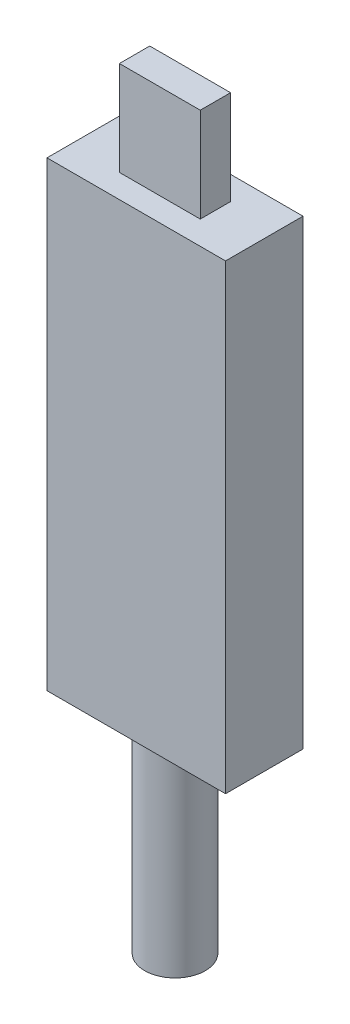
ISO-10303-21;
HEADER;
FILE_DESCRIPTION(('STEP AP214'),'2;1');
FILE_NAME('part.step','',(''),(''),'','','');
FILE_SCHEMA(('AUTOMOTIVE_DESIGN { 1 0 10303 214 1 1 1 1 }'));
ENDSEC;
DATA;
#1=APPLICATION_CONTEXT('core data for automotive mechanical design processes');
#2=APPLICATION_PROTOCOL_DEFINITION('international standard','automotive_design',2000,#1);
#3=PRODUCT_CONTEXT('',#1,'mechanical');
#4=PRODUCT('Part','Part','',(#3));
#5=PRODUCT_RELATED_PRODUCT_CATEGORY('part','',(#4));
#6=PRODUCT_DEFINITION_FORMATION('','',#4);
#7=PRODUCT_DEFINITION_CONTEXT('part definition',#1,'design');
#8=PRODUCT_DEFINITION('design','',#6,#7);
#9=PRODUCT_DEFINITION_SHAPE('','',#8);
#10=(LENGTH_UNIT() NAMED_UNIT(*) SI_UNIT(.MILLI.,.METRE.));
#11=(NAMED_UNIT(*) PLANE_ANGLE_UNIT() SI_UNIT($,.RADIAN.));
#12=(NAMED_UNIT(*) SI_UNIT($,.STERADIAN.) SOLID_ANGLE_UNIT());
#13=UNCERTAINTY_MEASURE_WITH_UNIT(LENGTH_MEASURE(1.E-05),#10,'distance_accuracy_value','');
#14=(GEOMETRIC_REPRESENTATION_CONTEXT(3) GLOBAL_UNCERTAINTY_ASSIGNED_CONTEXT((#13)) GLOBAL_UNIT_ASSIGNED_CONTEXT((#10,
#11,#12)) REPRESENTATION_CONTEXT('',''));
#15=CARTESIAN_POINT('',(0.,0.,0.));
#16=DIRECTION('',(0.,0.,1.));
#17=DIRECTION('',(1.,0.,0.));
#18=AXIS2_PLACEMENT_3D('',#15,#16,#17);
#19=CARTESIAN_POINT('',(-12.4102564102564,68.5,-3.75641025641024));
#20=DIRECTION('',(1.,0.,0.));
#21=DIRECTION('',(0.,0.,-1.));
#22=AXIS2_PLACEMENT_3D('',#19,#20,#21);
#23=PLANE('',#22);
#24=DIRECTION('',(0.,0.,1.));
#25=VECTOR('',#24,1.);
#26=CARTESIAN_POINT('',(-12.4102564102564,0.,-3.75641025641024));
#27=LINE('',#26,#25);
#28=CARTESIAN_POINT('',(-12.4102564102564,0.,-3.75641025641024));
#29=VERTEX_POINT('',#28);
#30=CARTESIAN_POINT('',(-12.4102564102564,0.,7.74358974358976));
#31=VERTEX_POINT('',#30);
#32=EDGE_CURVE('E126',#29,#31,#27,.T.);
#33=ORIENTED_EDGE('',*,*,#32,.T.);
#34=DIRECTION('',(0.,-1.,0.));
#35=VECTOR('',#34,1.);
#36=CARTESIAN_POINT('',(-12.4102564102564,68.5,7.74358974358976));
#37=LINE('',#36,#35);
#38=CARTESIAN_POINT('',(-12.4102564102564,68.5,7.74358974358976));
#39=VERTEX_POINT('',#38);
#40=EDGE_CURVE('E44',#39,#31,#37,.T.);
#41=ORIENTED_EDGE('',*,*,#40,.F.);
#42=DIRECTION('',(0.,0.,1.));
#43=VECTOR('',#42,1.);
#44=CARTESIAN_POINT('',(-12.4102564102564,68.5,-3.75641025641024));
#45=LINE('',#44,#43);
#46=CARTESIAN_POINT('',(-12.4102564102564,68.5,-3.75641025641024));
#47=VERTEX_POINT('',#46);
#48=EDGE_CURVE('E135',#47,#39,#45,.T.);
#49=ORIENTED_EDGE('',*,*,#48,.F.);
#50=DIRECTION('',(0.,-1.,0.));
#51=VECTOR('',#50,1.);
#52=CARTESIAN_POINT('',(-12.4102564102564,68.5,-3.75641025641024));
#53=LINE('',#52,#51);
#54=EDGE_CURVE('E144',#47,#29,#53,.T.);
#55=ORIENTED_EDGE('',*,*,#54,.T.);
#56=EDGE_LOOP('',(#33,#41,#49,#55));
#57=FACE_BOUND('',#56,.T.);
#58=ADVANCED_FACE('F41',(#57),#23,.F.);
#59=CARTESIAN_POINT('',(-12.4102564102564,68.5,7.74358974358976));
#60=DIRECTION('',(0.,0.,-1.));
#61=DIRECTION('',(-1.,0.,0.));
#62=AXIS2_PLACEMENT_3D('',#59,#60,#61);
#63=PLANE('',#62);
#64=DIRECTION('',(1.,0.,0.));
#65=VECTOR('',#64,1.);
#66=CARTESIAN_POINT('',(-12.4102564102564,0.,7.74358974358976));
#67=LINE('',#66,#65);
#68=CARTESIAN_POINT('',(14.0897435897436,0.,7.74358974358976));
#69=VERTEX_POINT('',#68);
#70=EDGE_CURVE('E129',#31,#69,#67,.T.);
#71=ORIENTED_EDGE('',*,*,#70,.T.);
#72=DIRECTION('',(0.,-1.,0.));
#73=VECTOR('',#72,1.);
#74=CARTESIAN_POINT('',(14.0897435897436,68.5,7.74358974358976));
#75=LINE('',#74,#73);
#76=CARTESIAN_POINT('',(14.0897435897436,68.5,7.74358974358976));
#77=VERTEX_POINT('',#76);
#78=EDGE_CURVE('E154',#77,#69,#75,.T.);
#79=ORIENTED_EDGE('',*,*,#78,.F.);
#80=DIRECTION('',(1.,0.,0.));
#81=VECTOR('',#80,1.);
#82=CARTESIAN_POINT('',(-12.4102564102564,68.5,7.74358974358976));
#83=LINE('',#82,#81);
#84=EDGE_CURVE('E138',#39,#77,#83,.T.);
#85=ORIENTED_EDGE('',*,*,#84,.F.);
#86=ORIENTED_EDGE('',*,*,#40,.T.);
#87=EDGE_LOOP('',(#71,#79,#85,#86));
#88=FACE_BOUND('',#87,.T.);
#89=ADVANCED_FACE('F163',(#88),#63,.F.);
#90=CARTESIAN_POINT('',(14.0897435897436,68.5,-3.75641025641024));
#91=DIRECTION('',(-1.,0.,0.));
#92=DIRECTION('',(0.,0.,1.));
#93=AXIS2_PLACEMENT_3D('',#90,#91,#92);
#94=PLANE('',#93);
#95=DIRECTION('',(0.,0.,-1.));
#96=VECTOR('',#95,1.);
#97=CARTESIAN_POINT('',(14.0897435897436,0.,-3.75641025641024));
#98=LINE('',#97,#96);
#99=CARTESIAN_POINT('',(14.0897435897436,0.,-3.75641025641024));
#100=VERTEX_POINT('',#99);
#101=EDGE_CURVE('E147',#69,#100,#98,.T.);
#102=ORIENTED_EDGE('',*,*,#101,.T.);
#103=DIRECTION('',(0.,-1.,0.));
#104=VECTOR('',#103,1.);
#105=CARTESIAN_POINT('',(14.0897435897436,68.5,-3.75641025641024));
#106=LINE('',#105,#104);
#107=CARTESIAN_POINT('',(14.0897435897436,68.5,-3.75641025641024));
#108=VERTEX_POINT('',#107);
#109=EDGE_CURVE('E152',#108,#100,#106,.T.);
#110=ORIENTED_EDGE('',*,*,#109,.F.);
#111=DIRECTION('',(0.,0.,-1.));
#112=VECTOR('',#111,1.);
#113=CARTESIAN_POINT('',(14.0897435897436,68.5,-3.75641025641024));
#114=LINE('',#113,#112);
#115=EDGE_CURVE('E141',#77,#108,#114,.T.);
#116=ORIENTED_EDGE('',*,*,#115,.F.);
#117=ORIENTED_EDGE('',*,*,#78,.T.);
#118=EDGE_LOOP('',(#102,#110,#116,#117));
#119=FACE_BOUND('',#118,.T.);
#120=ADVANCED_FACE('F172',(#119),#94,.F.);
#121=CARTESIAN_POINT('',(-12.4102564102564,68.5,-3.75641025641024));
#122=DIRECTION('',(0.,0.,1.));
#123=DIRECTION('',(1.,0.,0.));
#124=AXIS2_PLACEMENT_3D('',#121,#122,#123);
#125=PLANE('',#124);
#126=DIRECTION('',(-1.,0.,0.));
#127=VECTOR('',#126,1.);
#128=CARTESIAN_POINT('',(-12.4102564102564,0.,-3.75641025641024));
#129=LINE('',#128,#127);
#130=EDGE_CURVE('E139',#100,#29,#129,.T.);
#131=ORIENTED_EDGE('',*,*,#130,.T.);
#132=ORIENTED_EDGE('',*,*,#54,.F.);
#133=DIRECTION('',(-1.,0.,0.));
#134=VECTOR('',#133,1.);
#135=CARTESIAN_POINT('',(-12.4102564102564,68.5,-3.75641025641024));
#136=LINE('',#135,#134);
#137=EDGE_CURVE('E143',#108,#47,#136,.T.);
#138=ORIENTED_EDGE('',*,*,#137,.F.);
#139=ORIENTED_EDGE('',*,*,#109,.T.);
#140=EDGE_LOOP('',(#131,#132,#138,#139));
#141=FACE_BOUND('',#140,.T.);
#142=ADVANCED_FACE('F175',(#141),#125,.F.);
#143=CARTESIAN_POINT('',(0.,68.5,0.));
#144=DIRECTION('',(0.,1.,0.));
#145=DIRECTION('',(0.,0.,1.));
#146=AXIS2_PLACEMENT_3D('',#143,#144,#145);
#147=PLANE('',#146);
#148=DIRECTION('',(0.,0.,1.));
#149=VECTOR('',#148,1.);
#150=CARTESIAN_POINT('',(-5.16025641025641,68.5,-0.256410256410238));
#151=LINE('',#150,#149);
#152=CARTESIAN_POINT('',(-5.16025641025641,68.5,-0.256410256410238));
#153=VERTEX_POINT('',#152);
#154=CARTESIAN_POINT('',(-5.16025641025641,68.5,4.24358974358976));
#155=VERTEX_POINT('',#154);
#156=EDGE_CURVE('E56',#153,#155,#151,.T.);
#157=ORIENTED_EDGE('',*,*,#156,.F.);
#158=DIRECTION('',(-1.,0.,0.));
#159=VECTOR('',#158,1.);
#160=CARTESIAN_POINT('',(-5.16025641025641,68.5,-0.256410256410238));
#161=LINE('',#160,#159);
#162=CARTESIAN_POINT('',(6.83974358974359,68.5,-0.25641025641024));
#163=VERTEX_POINT('',#162);
#164=EDGE_CURVE('E60',#163,#153,#161,.T.);
#165=ORIENTED_EDGE('',*,*,#164,.F.);
#166=DIRECTION('',(0.,0.,-1.));
#167=VECTOR('',#166,1.);
#168=CARTESIAN_POINT('',(6.83974358974359,68.5,-0.25641025641024));
#169=LINE('',#168,#167);
#170=CARTESIAN_POINT('',(6.83974358974359,68.5,4.24358974358976));
#171=VERTEX_POINT('',#170);
#172=EDGE_CURVE('E291',#171,#163,#169,.T.);
#173=ORIENTED_EDGE('',*,*,#172,.F.);
#174=DIRECTION('',(1.,0.,0.));
#175=VECTOR('',#174,1.);
#176=CARTESIAN_POINT('',(-5.16025641025641,68.5,4.24358974358976));
#177=LINE('',#176,#175);
#178=EDGE_CURVE('E284',#155,#171,#177,.T.);
#179=ORIENTED_EDGE('',*,*,#178,.F.);
#180=EDGE_LOOP('',(#157,#165,#173,#179));
#181=FACE_BOUND('',#180,.T.);
#182=ORIENTED_EDGE('',*,*,#48,.T.);
#183=ORIENTED_EDGE('',*,*,#84,.T.);
#184=ORIENTED_EDGE('',*,*,#115,.T.);
#185=ORIENTED_EDGE('',*,*,#137,.T.);
#186=EDGE_LOOP('',(#182,#183,#184,#185));
#187=FACE_BOUND('',#186,.T.);
#188=ADVANCED_FACE('F177',(#181,#187),#147,.T.);
#189=CARTESIAN_POINT('',(0.,0.,0.));
#190=DIRECTION('',(0.,1.,0.));
#191=DIRECTION('',(0.,0.,1.));
#192=AXIS2_PLACEMENT_3D('',#189,#190,#191);
#193=PLANE('',#192);
#194=CARTESIAN_POINT('',(0.839743589743593,0.,1.99358974358976));
#195=DIRECTION('',(0.,-1.,0.));
#196=DIRECTION('',(0.,0.,-1.));
#197=AXIS2_PLACEMENT_3D('',#194,#195,#196);
#198=CIRCLE('',#197,4.5);
#199=CARTESIAN_POINT('',(0.839743589743593,0.,-2.50641025641024));
#200=VERTEX_POINT('',#199);
#201=EDGE_CURVE('E11',#200,#200,#198,.T.);
#202=ORIENTED_EDGE('',*,*,#201,.F.);
#203=EDGE_LOOP('',(#202));
#204=FACE_BOUND('',#203,.T.);
#205=ORIENTED_EDGE('',*,*,#32,.F.);
#206=ORIENTED_EDGE('',*,*,#130,.F.);
#207=ORIENTED_EDGE('',*,*,#101,.F.);
#208=ORIENTED_EDGE('',*,*,#70,.F.);
#209=EDGE_LOOP('',(#205,#206,#207,#208));
#210=FACE_BOUND('',#209,.T.);
#211=ADVANCED_FACE('F170',(#204,#210),#193,.F.);
#212=CARTESIAN_POINT('',(-5.16025641025641,82.5,-0.256410256410238));
#213=DIRECTION('',(1.,0.,0.));
#214=DIRECTION('',(0.,0.,-1.));
#215=AXIS2_PLACEMENT_3D('',#212,#213,#214);
#216=PLANE('',#215);
#217=ORIENTED_EDGE('',*,*,#156,.T.);
#218=DIRECTION('',(0.,-1.,0.));
#219=VECTOR('',#218,1.);
#220=CARTESIAN_POINT('',(-5.16025641025641,82.5,4.24358974358976));
#221=LINE('',#220,#219);
#222=CARTESIAN_POINT('',(-5.16025641025641,82.5,4.24358974358976));
#223=VERTEX_POINT('',#222);
#224=EDGE_CURVE('E109',#223,#155,#221,.T.);
#225=ORIENTED_EDGE('',*,*,#224,.F.);
#226=DIRECTION('',(0.,0.,1.));
#227=VECTOR('',#226,1.);
#228=CARTESIAN_POINT('',(-5.16025641025641,82.5,-0.256410256410238));
#229=LINE('',#228,#227);
#230=CARTESIAN_POINT('',(-5.16025641025641,82.5,-0.256410256410238));
#231=VERTEX_POINT('',#230);
#232=EDGE_CURVE('E115',#231,#223,#229,.T.);
#233=ORIENTED_EDGE('',*,*,#232,.F.);
#234=DIRECTION('',(0.,-1.,0.));
#235=VECTOR('',#234,1.);
#236=CARTESIAN_POINT('',(-5.16025641025641,82.5,-0.256410256410238));
#237=LINE('',#236,#235);
#238=EDGE_CURVE('E288',#231,#153,#237,.T.);
#239=ORIENTED_EDGE('',*,*,#238,.T.);
#240=EDGE_LOOP('',(#217,#225,#233,#239));
#241=FACE_BOUND('',#240,.T.);
#242=ADVANCED_FACE('F125',(#241),#216,.F.);
#243=CARTESIAN_POINT('',(-5.16025641025641,82.5,4.24358974358976));
#244=DIRECTION('',(0.,0.,-1.));
#245=DIRECTION('',(-1.,0.,0.));
#246=AXIS2_PLACEMENT_3D('',#243,#244,#245);
#247=PLANE('',#246);
#248=ORIENTED_EDGE('',*,*,#178,.T.);
#249=DIRECTION('',(0.,-1.,0.));
#250=VECTOR('',#249,1.);
#251=CARTESIAN_POINT('',(6.83974358974359,82.5,4.24358974358976));
#252=LINE('',#251,#250);
#253=CARTESIAN_POINT('',(6.83974358974359,82.5,4.24358974358976));
#254=VERTEX_POINT('',#253);
#255=EDGE_CURVE('E111',#254,#171,#252,.T.);
#256=ORIENTED_EDGE('',*,*,#255,.F.);
#257=DIRECTION('',(1.,0.,0.));
#258=VECTOR('',#257,1.);
#259=CARTESIAN_POINT('',(-5.16025641025641,82.5,4.24358974358976));
#260=LINE('',#259,#258);
#261=EDGE_CURVE('E104',#223,#254,#260,.T.);
#262=ORIENTED_EDGE('',*,*,#261,.F.);
#263=ORIENTED_EDGE('',*,*,#224,.T.);
#264=EDGE_LOOP('',(#248,#256,#262,#263));
#265=FACE_BOUND('',#264,.T.);
#266=ADVANCED_FACE('F107',(#265),#247,.F.);
#267=CARTESIAN_POINT('',(6.83974358974359,82.5,-0.25641025641024));
#268=DIRECTION('',(-1.,0.,0.));
#269=DIRECTION('',(0.,0.,1.));
#270=AXIS2_PLACEMENT_3D('',#267,#268,#269);
#271=PLANE('',#270);
#272=ORIENTED_EDGE('',*,*,#172,.T.);
#273=DIRECTION('',(0.,-1.,0.));
#274=VECTOR('',#273,1.);
#275=CARTESIAN_POINT('',(6.83974358974359,82.5,-0.25641025641024));
#276=LINE('',#275,#274);
#277=CARTESIAN_POINT('',(6.83974358974359,82.5,-0.25641025641024));
#278=VERTEX_POINT('',#277);
#279=EDGE_CURVE('E131',#278,#163,#276,.T.);
#280=ORIENTED_EDGE('',*,*,#279,.F.);
#281=DIRECTION('',(0.,0.,-1.));
#282=VECTOR('',#281,1.);
#283=CARTESIAN_POINT('',(6.83974358974359,82.5,-0.25641025641024));
#284=LINE('',#283,#282);
#285=EDGE_CURVE('E114',#254,#278,#284,.T.);
#286=ORIENTED_EDGE('',*,*,#285,.F.);
#287=ORIENTED_EDGE('',*,*,#255,.T.);
#288=EDGE_LOOP('',(#272,#280,#286,#287));
#289=FACE_BOUND('',#288,.T.);
#290=ADVANCED_FACE('F232',(#289),#271,.F.);
#291=CARTESIAN_POINT('',(-5.16025641025641,82.5,-0.256410256410238));
#292=DIRECTION('',(0.,0.,1.));
#293=DIRECTION('',(1.,0.,0.));
#294=AXIS2_PLACEMENT_3D('',#291,#292,#293);
#295=PLANE('',#294);
#296=ORIENTED_EDGE('',*,*,#164,.T.);
#297=ORIENTED_EDGE('',*,*,#238,.F.);
#298=DIRECTION('',(-1.,0.,0.));
#299=VECTOR('',#298,1.);
#300=CARTESIAN_POINT('',(-5.16025641025641,82.5,-0.256410256410238));
#301=LINE('',#300,#299);
#302=EDGE_CURVE('E120',#278,#231,#301,.T.);
#303=ORIENTED_EDGE('',*,*,#302,.F.);
#304=ORIENTED_EDGE('',*,*,#279,.T.);
#305=EDGE_LOOP('',(#296,#297,#303,#304));
#306=FACE_BOUND('',#305,.T.);
#307=ADVANCED_FACE('F241',(#306),#295,.F.);
#308=CARTESIAN_POINT('',(0.,82.5,0.));
#309=DIRECTION('',(0.,1.,0.));
#310=DIRECTION('',(0.,0.,1.));
#311=AXIS2_PLACEMENT_3D('',#308,#309,#310);
#312=PLANE('',#311);
#313=ORIENTED_EDGE('',*,*,#232,.T.);
#314=ORIENTED_EDGE('',*,*,#261,.T.);
#315=ORIENTED_EDGE('',*,*,#285,.T.);
#316=ORIENTED_EDGE('',*,*,#302,.T.);
#317=EDGE_LOOP('',(#313,#314,#315,#316));
#318=FACE_BOUND('',#317,.T.);
#319=ADVANCED_FACE('F118',(#318),#312,.T.);
#320=CARTESIAN_POINT('',(0.839743589743593,-30.,1.99358974358976));
#321=DIRECTION('',(0.,1.,0.));
#322=DIRECTION('',(0.,0.,1.));
#323=AXIS2_PLACEMENT_3D('',#320,#321,#322);
#324=CYLINDRICAL_SURFACE('',#323,4.5);
#325=CARTESIAN_POINT('',(0.839743589743593,-30.,1.99358974358976));
#326=DIRECTION('',(0.,-1.,0.));
#327=DIRECTION('',(0.,0.,-1.));
#328=AXIS2_PLACEMENT_3D('',#325,#326,#327);
#329=CIRCLE('',#328,4.5);
#330=CARTESIAN_POINT('',(0.839743589743593,-30.,-2.50641025641024));
#331=VERTEX_POINT('',#330);
#332=EDGE_CURVE('E282',#331,#331,#329,.T.);
#333=ORIENTED_EDGE('',*,*,#332,.F.);
#334=EDGE_LOOP('',(#333));
#335=FACE_BOUND('',#334,.T.);
#336=ORIENTED_EDGE('',*,*,#201,.T.);
#337=EDGE_LOOP('',(#336));
#338=FACE_BOUND('',#337,.T.);
#339=ADVANCED_FACE('F259',(#335,#338),#324,.T.);
#340=CARTESIAN_POINT('',(0.839743589743593,-30.,1.99358974358976));
#341=DIRECTION('',(0.,-1.,0.));
#342=DIRECTION('',(0.,0.,-1.));
#343=AXIS2_PLACEMENT_3D('',#340,#341,#342);
#344=PLANE('',#343);
#345=ORIENTED_EDGE('',*,*,#332,.T.);
#346=EDGE_LOOP('',(#345));
#347=FACE_BOUND('',#346,.T.);
#348=ADVANCED_FACE('F267',(#347),#344,.T.);
#349=CLOSED_SHELL('',(#58,#89,#120,#142,#188,#211,#242,#266,#290,#307,#319,#339,#348));
#350=MANIFOLD_SOLID_BREP('B2',#349);
#351=ADVANCED_BREP_SHAPE_REPRESENTATION('',(#18,#350),#14);
#352=SHAPE_DEFINITION_REPRESENTATION(#9,#351);
ENDSEC;
END-ISO-10303-21;
